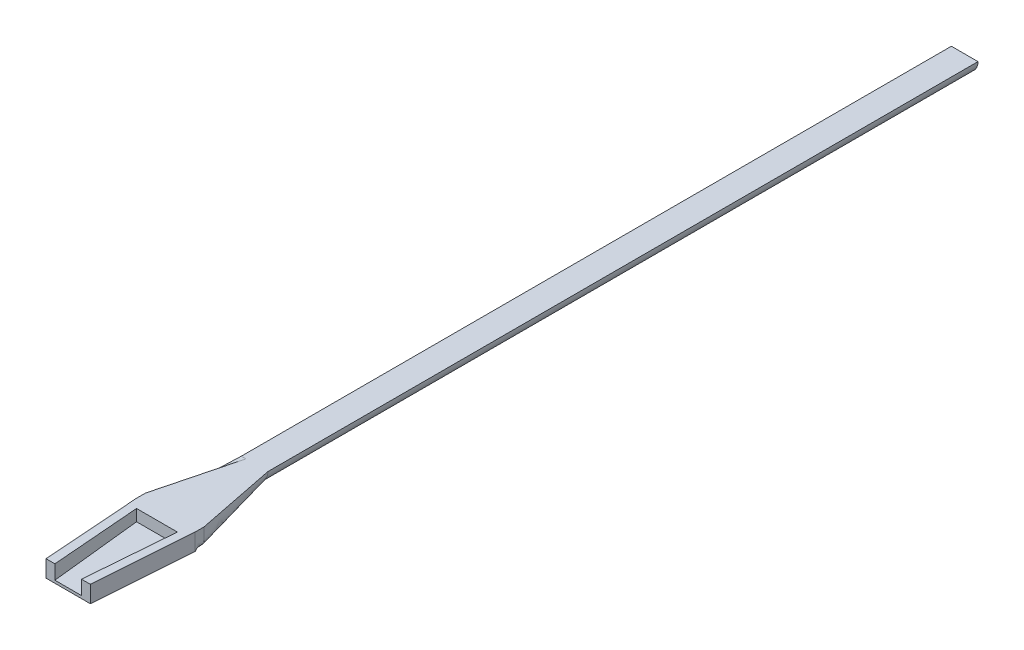
ISO-10303-21;
HEADER;
FILE_DESCRIPTION(('STEP AP214'),'2;1');
FILE_NAME('part.step','',(''),(''),'','','');
FILE_SCHEMA(('AUTOMOTIVE_DESIGN { 1 0 10303 214 1 1 1 1 }'));
ENDSEC;
DATA;
#1=APPLICATION_CONTEXT('core data for automotive mechanical design processes');
#2=APPLICATION_PROTOCOL_DEFINITION('international standard','automotive_design',2000,#1);
#3=PRODUCT_CONTEXT('',#1,'mechanical');
#4=PRODUCT('Part','Part','',(#3));
#5=PRODUCT_RELATED_PRODUCT_CATEGORY('part','',(#4));
#6=PRODUCT_DEFINITION_FORMATION('','',#4);
#7=PRODUCT_DEFINITION_CONTEXT('part definition',#1,'design');
#8=PRODUCT_DEFINITION('design','',#6,#7);
#9=PRODUCT_DEFINITION_SHAPE('','',#8);
#10=(LENGTH_UNIT() NAMED_UNIT(*) SI_UNIT(.MILLI.,.METRE.));
#11=(NAMED_UNIT(*) PLANE_ANGLE_UNIT() SI_UNIT($,.RADIAN.));
#12=(NAMED_UNIT(*) SI_UNIT($,.STERADIAN.) SOLID_ANGLE_UNIT());
#13=UNCERTAINTY_MEASURE_WITH_UNIT(LENGTH_MEASURE(1.E-05),#10,'distance_accuracy_value','');
#14=(GEOMETRIC_REPRESENTATION_CONTEXT(3) GLOBAL_UNCERTAINTY_ASSIGNED_CONTEXT((#13)) GLOBAL_UNIT_ASSIGNED_CONTEXT((#10,
#11,#12)) REPRESENTATION_CONTEXT('',''));
#15=CARTESIAN_POINT('',(0.,0.,0.));
#16=DIRECTION('',(0.,0.,1.));
#17=DIRECTION('',(1.,0.,0.));
#18=AXIS2_PLACEMENT_3D('',#15,#16,#17);
#19=CARTESIAN_POINT('',(0.,0.,-90.));
#20=DIRECTION('',(0.,0.,1.));
#21=DIRECTION('',(1.,0.,0.));
#22=AXIS2_PLACEMENT_3D('',#19,#20,#21);
#23=CYLINDRICAL_SURFACE('',#22,1.5);
#24=DIRECTION('',(0.,0.,1.));
#25=VECTOR('',#24,1.);
#26=CARTESIAN_POINT('',(1.5,0.,-90.));
#27=LINE('',#26,#25);
#28=CARTESIAN_POINT('',(1.5,0.,-10.));
#29=VERTEX_POINT('',#28);
#30=CARTESIAN_POINT('',(1.5,0.,-90.));
#31=VERTEX_POINT('',#30);
#32=EDGE_CURVE('E400',#29,#31,#27,.F.);
#33=ORIENTED_EDGE('',*,*,#32,.F.);
#34=CARTESIAN_POINT('',(-1.5,0.,-10.));
#35=CARTESIAN_POINT('',(-1.5,-0.0340849035523239,-10.));
#36=CARTESIAN_POINT('',(-1.49770013870791,-0.100364686866846,-10.));
#37=CARTESIAN_POINT('',(-1.48805703988034,-0.197016495207658,-9.99999999999999));
#38=CARTESIAN_POINT('',(-1.47217993167286,-0.293078553098663,-10.));
#39=CARTESIAN_POINT('',(-1.45702067216842,-0.358160066350974,-10.));
#40=CARTESIAN_POINT('',(-1.38020657400928,-0.642319357134759,-10.));
#41=CARTESIAN_POINT('',(-1.1105933390229,-1.11010631694387,-10.));
#42=CARTESIAN_POINT('',(-0.405829361337868,-1.51725944924718,-10.));
#43=CARTESIAN_POINT('',(0.40809019758457,-1.51631658641463,-10.));
#44=CARTESIAN_POINT('',(0.875236322684468,-1.24559452589605,-10.));
#45=CARTESIAN_POINT('',(1.08365515619601,-1.03772798685612,-10.));
#46=CARTESIAN_POINT('',(1.12928105154975,-0.988904998529896,-9.99999999999999));
#47=CARTESIAN_POINT('',(1.19099547505305,-0.913596755535237,-10.));
#48=CARTESIAN_POINT('',(1.24760275662092,-0.834665284726423,-9.99999999999999));
#49=CARTESIAN_POINT('',(1.28268462080514,-0.778384188046074,-10.));
#50=CARTESIAN_POINT('',(1.33177957928485,-0.693175264975758,-10.));
#51=CARTESIAN_POINT('',(1.38954267851461,-0.576307118216063,-9.99999999999999));
#52=CARTESIAN_POINT('',(1.45327996055997,-0.388723046354751,-10.));
#53=CARTESIAN_POINT('',(1.49170409745565,-0.194367312456596,-9.99999999999999));
#54=CARTESIAN_POINT('',(1.5,-0.0642557061617075,-10.));
#55=CARTESIAN_POINT('',(1.5,0.,-10.));
#56=B_SPLINE_CURVE_WITH_KNOTS('',3,(#34,#35,#36,#37,#38,#39,#40,#41,#42,#43,#44,#45,#46,#47,#48,
#49,#50,#51,#52,#53,#54,#55),.UNSPECIFIED.,.F.,.F.,(4,1,1,1,2,1,1,1,2,1,1,1,2,1,1,1,4),(0.,
0.0218802470232264,0.0437604940464527,0.0656407410696791,0.0875209880929054,0.252512592855743,
0.417504197618581,0.582495802381419,0.747487407144257,0.769367654167483,0.791247901190709,
0.813128148213936,0.835008395237162,0.876256296427872,0.917504197618581,0.95875209880929,1.),.UNSPECIFIED.);
#57=CARTESIAN_POINT('',(-1.5,0.,-10.));
#58=VERTEX_POINT('',#57);
#59=EDGE_CURVE('E289',#58,#29,#56,.T.);
#60=ORIENTED_EDGE('',*,*,#59,.F.);
#61=DIRECTION('',(0.,0.,1.));
#62=VECTOR('',#61,1.);
#63=CARTESIAN_POINT('',(-1.5,0.,-90.));
#64=LINE('',#63,#62);
#65=CARTESIAN_POINT('',(-1.5,0.,-90.));
#66=VERTEX_POINT('',#65);
#67=EDGE_CURVE('E162',#66,#58,#64,.T.);
#68=ORIENTED_EDGE('',*,*,#67,.F.);
#69=CARTESIAN_POINT('',(0.,0.,-90.));
#70=DIRECTION('',(0.,0.,1.));
#71=DIRECTION('',(1.,0.,0.));
#72=AXIS2_PLACEMENT_3D('',#69,#70,#71);
#73=CIRCLE('',#72,1.5);
#74=EDGE_CURVE('E152',#66,#31,#73,.T.);
#75=ORIENTED_EDGE('',*,*,#74,.T.);
#76=EDGE_LOOP('',(#33,#60,#68,#75));
#77=FACE_BOUND('',#76,.T.);
#78=ADVANCED_FACE('F143',(#77),#23,.T.);
#79=CARTESIAN_POINT('',(0.,0.,-90.));
#80=DIRECTION('',(0.,0.,1.));
#81=DIRECTION('',(1.,0.,0.));
#82=AXIS2_PLACEMENT_3D('',#79,#80,#81);
#83=PLANE('',#82);
#84=ORIENTED_EDGE('',*,*,#74,.F.);
#85=DIRECTION('',(1.,0.,0.));
#86=VECTOR('',#85,1.);
#87=CARTESIAN_POINT('',(-3.58187881499397,0.,-90.));
#88=LINE('',#87,#86);
#89=EDGE_CURVE('E379',#66,#31,#88,.T.);
#90=ORIENTED_EDGE('',*,*,#89,.T.);
#91=EDGE_LOOP('',(#84,#90));
#92=FACE_BOUND('',#91,.T.);
#93=ADVANCED_FACE('F632',(#92),#83,.F.);
#94=CARTESIAN_POINT('',(-3.58187881499397,0.,-90.));
#95=DIRECTION('',(0.,-1.,0.));
#96=DIRECTION('',(0.,0.,-1.));
#97=AXIS2_PLACEMENT_3D('',#94,#95,#96);
#98=PLANE('',#97);
#99=ORIENTED_EDGE('',*,*,#32,.T.);
#100=ORIENTED_EDGE('',*,*,#89,.F.);
#101=ORIENTED_EDGE('',*,*,#67,.T.);
#102=DIRECTION('',(1.,0.,0.));
#103=VECTOR('',#102,1.);
#104=CARTESIAN_POINT('',(-3.58187881499397,0.,-9.99999999999999));
#105=LINE('',#104,#103);
#106=CARTESIAN_POINT('',(-0.975000000000002,0.,-10.));
#107=VERTEX_POINT('',#106);
#108=EDGE_CURVE('E12',#58,#107,#105,.T.);
#109=ORIENTED_EDGE('',*,*,#108,.T.);
#110=CARTESIAN_POINT('',(-3.3,0.,-1.));
#111=CARTESIAN_POINT('',(-0.975000000000003,0.,-10.));
#112=B_SPLINE_CURVE_WITH_KNOTS('',1,(#110,#111),.UNSPECIFIED.,.F.,.F.,(2,2),(0.,1.),.UNSPECIFIED.);
#113=CARTESIAN_POINT('',(-3.3,0.,-1.));
#114=VERTEX_POINT('',#113);
#115=EDGE_CURVE('E366',#107,#114,#112,.F.);
#116=ORIENTED_EDGE('',*,*,#115,.T.);
#117=DIRECTION('',(0.,0.,-1.));
#118=VECTOR('',#117,1.);
#119=CARTESIAN_POINT('',(-3.3,0.,-0.5));
#120=LINE('',#119,#118);
#121=CARTESIAN_POINT('',(-3.3,0.,0.));
#122=VERTEX_POINT('',#121);
#123=EDGE_CURVE('E661',#122,#114,#120,.T.);
#124=ORIENTED_EDGE('',*,*,#123,.F.);
#125=DIRECTION('',(-0.0725356957788214,0.,-0.997365816958794));
#126=VECTOR('',#125,1.);
#127=CARTESIAN_POINT('',(-3.28263729036501,0.,0.238737257481092));
#128=LINE('',#127,#126);
#129=CARTESIAN_POINT('',(-2.5,0.,11.));
#130=VERTEX_POINT('',#129);
#131=EDGE_CURVE('E536',#130,#122,#128,.T.);
#132=ORIENTED_EDGE('',*,*,#131,.F.);
#133=DIRECTION('',(-1.,0.,0.));
#134=VECTOR('',#133,1.);
#135=CARTESIAN_POINT('',(0.,0.,11.));
#136=LINE('',#135,#134);
#137=CARTESIAN_POINT('',(-1.5,0.,11.));
#138=VERTEX_POINT('',#137);
#139=EDGE_CURVE('E456',#138,#130,#136,.T.);
#140=ORIENTED_EDGE('',*,*,#139,.F.);
#141=DIRECTION('',(-0.0797452222828899,0.,-0.996815278536125));
#142=VECTOR('',#141,1.);
#143=CARTESIAN_POINT('',(-2.39261093999815,0.,-0.157636749976912));
#144=LINE('',#143,#142);
#145=CARTESIAN_POINT('',(-2.3,0.,1.));
#146=VERTEX_POINT('',#145);
#147=EDGE_CURVE('E431',#138,#146,#144,.T.);
#148=ORIENTED_EDGE('',*,*,#147,.T.);
#149=DIRECTION('',(-1.,0.,0.));
#150=VECTOR('',#149,1.);
#151=CARTESIAN_POINT('',(-4.36182031470955,0.,1.));
#152=LINE('',#151,#150);
#153=CARTESIAN_POINT('',(2.3,0.,1.));
#154=VERTEX_POINT('',#153);
#155=EDGE_CURVE('E427',#154,#146,#152,.T.);
#156=ORIENTED_EDGE('',*,*,#155,.F.);
#157=DIRECTION('',(-0.07974522228289,0.,0.996815278536125));
#158=VECTOR('',#157,1.);
#159=CARTESIAN_POINT('',(2.33713468798277,0.,0.535816400215386));
#160=LINE('',#159,#158);
#161=CARTESIAN_POINT('',(1.5,0.,11.));
#162=VERTEX_POINT('',#161);
#163=EDGE_CURVE('E425',#154,#162,#160,.T.);
#164=ORIENTED_EDGE('',*,*,#163,.T.);
#165=CARTESIAN_POINT('',(2.5,0.,11.));
#166=VERTEX_POINT('',#165);
#167=EDGE_CURVE('E258',#166,#162,#136,.T.);
#168=ORIENTED_EDGE('',*,*,#167,.F.);
#169=DIRECTION('',(-0.0725356957788214,0.,0.997365816958794));
#170=VECTOR('',#169,1.);
#171=CARTESIAN_POINT('',(3.28263729036501,0.,0.238737257481092));
#172=LINE('',#171,#170);
#173=CARTESIAN_POINT('',(3.3,0.,0.));
#174=VERTEX_POINT('',#173);
#175=EDGE_CURVE('E254',#174,#166,#172,.T.);
#176=ORIENTED_EDGE('',*,*,#175,.F.);
#177=DIRECTION('',(0.,0.,1.));
#178=VECTOR('',#177,1.);
#179=CARTESIAN_POINT('',(3.3,0.,-0.5));
#180=LINE('',#179,#178);
#181=CARTESIAN_POINT('',(3.3,0.,-1.));
#182=VERTEX_POINT('',#181);
#183=EDGE_CURVE('E240',#182,#174,#180,.T.);
#184=ORIENTED_EDGE('',*,*,#183,.F.);
#185=CARTESIAN_POINT('',(1.5,0.,-10.));
#186=CARTESIAN_POINT('',(3.3,0.,-1.));
#187=B_SPLINE_CURVE_WITH_KNOTS('',1,(#185,#186),.UNSPECIFIED.,.F.,.F.,(2,2),(0.,1.),.UNSPECIFIED.);
#188=EDGE_CURVE('E375',#182,#29,#187,.F.);
#189=ORIENTED_EDGE('',*,*,#188,.T.);
#190=EDGE_LOOP('',(#99,#100,#101,#109,#116,#124,#132,#140,#148,#156,#164,#168,#176,#184,#189));
#191=FACE_BOUND('',#190,.T.);
#192=ADVANCED_FACE('F255',(#191),#98,.F.);
#193=CARTESIAN_POINT('',(-0.975000000000003,0.,-10.));
#194=CARTESIAN_POINT('',(-3.3,0.,-1.));
#195=CARTESIAN_POINT('',(-1.5,0.,-10.));
#196=CARTESIAN_POINT('',(-3.3,-1.4,-1.));
#197=B_SPLINE_SURFACE_WITH_KNOTS('',1,1,((#193,#194),(#195,#196)),.UNSPECIFIED.,.F.,.F.,.F.,(2,
2),(2,2),(0.,1.),(0.,1.),.UNSPECIFIED.);
#198=CARTESIAN_POINT('',(-1.5,0.,-10.));
#199=CARTESIAN_POINT('',(-3.3,-1.4,-1.));
#200=B_SPLINE_CURVE_WITH_KNOTS('',1,(#198,#199),.UNSPECIFIED.,.F.,.F.,(2,2),(0.,1.),.UNSPECIFIED.);
#201=CARTESIAN_POINT('',(-3.3,-1.4,-1.));
#202=VERTEX_POINT('',#201);
#203=EDGE_CURVE('E426',#58,#202,#200,.T.);
#204=CARTESIAN_POINT('',(-3.3,-1.4,-1.));
#205=CARTESIAN_POINT('',(-3.3,0.,-1.));
#206=B_SPLINE_CURVE_WITH_KNOTS('',1,(#204,#205),.UNSPECIFIED.,.F.,.F.,(2,2),(0.,1.),.UNSPECIFIED.);
#207=EDGE_CURVE('E356',#114,#202,#206,.F.);
#208=ORIENTED_EDGE('',*,*,#108,.F.);
#209=ORIENTED_EDGE('',*,*,#203,.T.);
#210=ORIENTED_EDGE('',*,*,#207,.F.);
#211=ORIENTED_EDGE('',*,*,#115,.F.);
#212=EDGE_LOOP('',(#208,#209,#210,#211));
#213=FACE_BOUND('',#212,.T.);
#214=ADVANCED_FACE('F308',(#213),#197,.T.);
#215=CARTESIAN_POINT('',(-1.5,0.,-10.));
#216=CARTESIAN_POINT('',(-3.3,-1.4,-1.));
#217=CARTESIAN_POINT('',(-1.5,-0.0340849035523239,-10.));
#218=CARTESIAN_POINT('',(-3.3,-1.46312167221356,-1.));
#219=CARTESIAN_POINT('',(-1.49770013870791,-0.100364686866846,-10.));
#220=CARTESIAN_POINT('',(-3.27564705688287,-1.5932935025808,-1.));
#221=CARTESIAN_POINT('',(-1.48805703988034,-0.197016495207658,-9.99999999999999));
#222=CARTESIAN_POINT('',(-3.16218878960373,-1.76446622574241,-1.));
#223=CARTESIAN_POINT('',(-1.47217993167286,-0.293078553098663,-10.));
#224=CARTESIAN_POINT('',(-2.9911345861593,-1.87627535213516,-1.));
#225=CARTESIAN_POINT('',(-1.45702067216842,-0.358160066350974,-10.));
#226=CARTESIAN_POINT('',(-2.86230387603072,-1.9,-1.));
#227=CARTESIAN_POINT('',(-1.38020657400928,-0.642319357134759,-10.));
#228=CARTESIAN_POINT('',(-2.33018736281965,-1.9,-1.));
#229=CARTESIAN_POINT('',(-1.1105933390229,-1.11010631694387,-10.));
#230=CARTESIAN_POINT('',(-1.39532779393049,-1.9,-1.));
#231=CARTESIAN_POINT('',(-0.405829361337868,-1.51725944924718,-10.));
#232=CARTESIAN_POINT('',(0.,-1.9,-0.999999999999998));
#233=CARTESIAN_POINT('',(0.40809019758457,-1.51631658641463,-10.));
#234=CARTESIAN_POINT('',(1.39532779393049,-1.9,-1.));
#235=CARTESIAN_POINT('',(0.875236322684468,-1.24559452589605,-10.));
#236=CARTESIAN_POINT('',(2.33018736281965,-1.9,-1.));
#237=CARTESIAN_POINT('',(1.08365515619601,-1.03772798685612,-10.));
#238=CARTESIAN_POINT('',(2.86230387603072,-1.9,-1.));
#239=CARTESIAN_POINT('',(1.12928105154975,-0.988904998529896,-9.99999999999999));
#240=CARTESIAN_POINT('',(2.99113458615929,-1.87627535213516,-1.));
#241=CARTESIAN_POINT('',(1.19099547505305,-0.913596755535237,-10.));
#242=CARTESIAN_POINT('',(3.16218878960373,-1.76446622574241,-1.));
#243=CARTESIAN_POINT('',(1.24760275662092,-0.834665284726423,-9.99999999999999));
#244=CARTESIAN_POINT('',(3.27564705688286,-1.5932935025808,-0.999999999999999));
#245=CARTESIAN_POINT('',(1.28268462080514,-0.778384188046074,-10.));
#246=CARTESIAN_POINT('',(3.3,-1.46312167221357,-1.));
#247=CARTESIAN_POINT('',(1.33177957928485,-0.693175264975758,-10.));
#248=CARTESIAN_POINT('',(3.3,-1.28100515900782,-1.));
#249=CARTESIAN_POINT('',(1.38954267851461,-0.576307118216063,-9.99999999999999));
#250=CARTESIAN_POINT('',(3.3,-1.04660877261765,-0.999999999999999));
#251=CARTESIAN_POINT('',(1.45327996055997,-0.388723046354751,-10.));
#252=CARTESIAN_POINT('',(3.3,-0.7,-1.));
#253=CARTESIAN_POINT('',(1.49170409745565,-0.194367312456596,-9.99999999999999));
#254=CARTESIAN_POINT('',(3.3,-0.353391227382354,-0.999999999999999));
#255=CARTESIAN_POINT('',(1.5,-0.0642557061617075,-10.));
#256=CARTESIAN_POINT('',(3.3,-0.118994840992179,-1.));
#257=CARTESIAN_POINT('',(1.5,0.,-10.));
#258=CARTESIAN_POINT('',(3.3,0.,-1.));
#259=B_SPLINE_SURFACE_WITH_KNOTS('',3,1,((#215,#216),(#217,#218),(#219,#220),(#221,#222),(#223,
#224),(#225,#226),(#227,#228),(#229,#230),(#231,#232),(#233,#234),(#235,#236),(#237,#238),(#239,
#240),(#241,#242),(#243,#244),(#245,#246),(#247,#248),(#249,#250),(#251,#252),(#253,#254),(#255,
#256),(#257,#258)),.UNSPECIFIED.,.F.,.F.,.F.,(4,1,1,1,2,1,1,1,2,1,1,1,2,1,1,1,4),(2,2),(0.,
0.0218802470232264,0.0437604940464527,0.0656407410696791,0.0875209880929054,0.252512592855743,
0.417504197618581,0.582495802381419,0.747487407144257,0.769367654167483,0.791247901190709,
0.813128148213936,0.835008395237162,0.876256296427872,0.917504197618581,0.95875209880929,1.),
(0.,1.),.UNSPECIFIED.);
#260=CARTESIAN_POINT('',(2.8,-1.9,-1.));
#261=CARTESIAN_POINT('',(2.8634613838908,-1.9,-1.));
#262=CARTESIAN_POINT('',(2.99341230687717,-1.87539276065853,-1.));
#263=CARTESIAN_POINT('',(3.16312222033253,-1.76320521238392,-1.));
#264=CARTESIAN_POINT('',(3.27542213843699,-1.59338446295593,-0.999999999999999));
#265=CARTESIAN_POINT('',(3.3,-1.4634613838908,-1.));
#266=CARTESIAN_POINT('',(3.3,-1.28134487068727,-1.));
#267=CARTESIAN_POINT('',(3.3,-1.04709122626305,-1.));
#268=CARTESIAN_POINT('',(3.3,-0.7,-1.));
#269=CARTESIAN_POINT('',(3.3,-0.35290877373695,-0.999999999999999));
#270=CARTESIAN_POINT('',(3.3,-0.118655129312731,-1.));
#271=CARTESIAN_POINT('',(3.3,0.,-1.));
#272=B_SPLINE_CURVE_WITH_KNOTS('',3,(#260,#261,#262,#263,#264,#265,#266,#267,#268,#269,#270,
#271),.UNSPECIFIED.,.F.,.F.,(4,1,1,1,2,1,1,1,4),(0.,0.0871164605607591,0.174232921121518,
0.261349381682277,0.348465842243036,0.511349381682277,0.674232921121518,0.837116460560759,1.),.UNSPECIFIED.);
#273=CARTESIAN_POINT('',(3.3,-1.40000000000001,-1.));
#274=VERTEX_POINT('',#273);
#275=EDGE_CURVE('E248',#274,#182,#272,.T.);
#276=CARTESIAN_POINT('',(2.8,-1.9,-1.));
#277=CARTESIAN_POINT('',(2.8634613838908,-1.9,-1.));
#278=CARTESIAN_POINT('',(2.99341230687717,-1.87539276065853,-1.));
#279=CARTESIAN_POINT('',(3.16312222033253,-1.76320521238392,-1.));
#280=CARTESIAN_POINT('',(3.27542213843699,-1.59338446295593,-0.999999999999999));
#281=CARTESIAN_POINT('',(3.3,-1.4634613838908,-1.));
#282=CARTESIAN_POINT('',(3.3,-1.28134487068727,-1.));
#283=CARTESIAN_POINT('',(3.3,-1.04709122626305,-1.));
#284=CARTESIAN_POINT('',(3.3,-0.7,-1.));
#285=CARTESIAN_POINT('',(3.3,-0.35290877373695,-0.999999999999999));
#286=CARTESIAN_POINT('',(3.3,-0.118655129312731,-1.));
#287=CARTESIAN_POINT('',(3.3,0.,-1.));
#288=B_SPLINE_CURVE_WITH_KNOTS('',3,(#276,#277,#278,#279,#280,#281,#282,#283,#284,#285,#286,
#287),.UNSPECIFIED.,.F.,.F.,(4,1,1,1,2,1,1,1,4),(0.,0.0871164605607591,0.174232921121518,
0.261349381682277,0.348465842243036,0.511349381682277,0.674232921121518,0.837116460560759,1.),.UNSPECIFIED.);
#289=CARTESIAN_POINT('',(2.8,-1.9,-1.));
#290=VERTEX_POINT('',#289);
#291=EDGE_CURVE('E648',#290,#274,#288,.T.);
#292=CARTESIAN_POINT('',(-3.3,-1.4,-1.));
#293=CARTESIAN_POINT('',(-3.3,-1.46254259421884,-1.));
#294=CARTESIAN_POINT('',(-3.2760739513545,-1.59195495654766,-0.999999999999999));
#295=CARTESIAN_POINT('',(-3.16341441415953,-1.76332487724037,-1.));
#296=CARTESIAN_POINT('',(-2.99192001684146,-1.87610432454889,-0.999999999999999));
#297=CARTESIAN_POINT('',(-2.86254259421884,-1.9,-1.));
#298=CARTESIAN_POINT('',(-2.33042608100932,-1.9,-1.));
#299=CARTESIAN_POINT('',(-1.39567906672759,-1.9,-0.999999999999999));
#300=CARTESIAN_POINT('',(0.,-1.9,-1.));
#301=CARTESIAN_POINT('',(1.39567906672759,-1.9,-0.999999999999999));
#302=CARTESIAN_POINT('',(2.33042608100932,-1.9,-1.));
#303=CARTESIAN_POINT('',(2.8,-1.9,-1.));
#304=B_SPLINE_CURVE_WITH_KNOTS('',3,(#292,#293,#294,#295,#296,#297,#298,#299,#300,#301,#302,
#303),.UNSPECIFIED.,.F.,.F.,(4,1,1,1,2,1,1,1,4),(0.,0.0293838816431009,0.0587677632862018,
0.0881516449293027,0.117535526572404,0.338151644929303,0.558767763286202,0.779383881643101,1.),.UNSPECIFIED.);
#305=CARTESIAN_POINT('',(-2.8,-1.9,-1.));
#306=VERTEX_POINT('',#305);
#307=EDGE_CURVE('E649',#306,#290,#304,.T.);
#308=CARTESIAN_POINT('',(-3.3,-1.4,-1.));
#309=CARTESIAN_POINT('',(-3.3,-1.46254259421884,-1.));
#310=CARTESIAN_POINT('',(-3.2760739513545,-1.59195495654766,-0.999999999999999));
#311=CARTESIAN_POINT('',(-3.16341441415953,-1.76332487724037,-1.));
#312=CARTESIAN_POINT('',(-2.99192001684146,-1.87610432454889,-0.999999999999999));
#313=CARTESIAN_POINT('',(-2.86254259421884,-1.9,-1.));
#314=CARTESIAN_POINT('',(-2.33042608100932,-1.9,-1.));
#315=CARTESIAN_POINT('',(-1.39567906672759,-1.9,-0.999999999999999));
#316=CARTESIAN_POINT('',(0.,-1.9,-1.));
#317=CARTESIAN_POINT('',(1.39567906672759,-1.9,-0.999999999999999));
#318=CARTESIAN_POINT('',(2.33042608100932,-1.9,-1.));
#319=CARTESIAN_POINT('',(2.8,-1.9,-1.));
#320=B_SPLINE_CURVE_WITH_KNOTS('',3,(#308,#309,#310,#311,#312,#313,#314,#315,#316,#317,#318,
#319),.UNSPECIFIED.,.F.,.F.,(4,1,1,1,2,1,1,1,4),(0.,0.0293838816431009,0.0587677632862018,
0.0881516449293027,0.117535526572404,0.338151644929303,0.558767763286202,0.779383881643101,1.),.UNSPECIFIED.);
#321=EDGE_CURVE('E647',#202,#306,#320,.T.);
#322=ORIENTED_EDGE('',*,*,#59,.T.);
#323=ORIENTED_EDGE('',*,*,#188,.F.);
#324=ORIENTED_EDGE('',*,*,#275,.F.);
#325=ORIENTED_EDGE('',*,*,#291,.F.);
#326=ORIENTED_EDGE('',*,*,#307,.F.);
#327=ORIENTED_EDGE('',*,*,#321,.F.);
#328=ORIENTED_EDGE('',*,*,#203,.F.);
#329=EDGE_LOOP('',(#322,#323,#324,#325,#326,#327,#328));
#330=FACE_BOUND('',#329,.T.);
#331=ADVANCED_FACE('F295',(#330),#259,.T.);
#332=CARTESIAN_POINT('',(0.,0.,11.));
#333=DIRECTION('',(0.,0.,-1.));
#334=DIRECTION('',(-1.,0.,0.));
#335=AXIS2_PLACEMENT_3D('',#332,#333,#334);
#336=PLANE('',#335);
#337=ORIENTED_EDGE('',*,*,#167,.T.);
#338=DIRECTION('',(0.,1.,0.));
#339=VECTOR('',#338,1.);
#340=CARTESIAN_POINT('',(1.5,-1.6,11.));
#341=LINE('',#340,#339);
#342=CARTESIAN_POINT('',(1.5,-1.6,11.));
#343=VERTEX_POINT('',#342);
#344=EDGE_CURVE('E666',#343,#162,#341,.T.);
#345=ORIENTED_EDGE('',*,*,#344,.F.);
#346=DIRECTION('',(1.,0.,0.));
#347=VECTOR('',#346,1.);
#348=CARTESIAN_POINT('',(-1.5,-1.6,11.));
#349=LINE('',#348,#347);
#350=CARTESIAN_POINT('',(-1.5,-1.6,11.));
#351=VERTEX_POINT('',#350);
#352=EDGE_CURVE('E742',#351,#343,#349,.T.);
#353=ORIENTED_EDGE('',*,*,#352,.F.);
#354=DIRECTION('',(0.,-1.,0.));
#355=VECTOR('',#354,1.);
#356=CARTESIAN_POINT('',(-1.5,-1.6,11.));
#357=LINE('',#356,#355);
#358=EDGE_CURVE('E744',#138,#351,#357,.T.);
#359=ORIENTED_EDGE('',*,*,#358,.F.);
#360=ORIENTED_EDGE('',*,*,#139,.T.);
#361=DIRECTION('',(0.,-1.,0.));
#362=VECTOR('',#361,1.);
#363=CARTESIAN_POINT('',(-2.5,-1.9,11.));
#364=LINE('',#363,#362);
#365=CARTESIAN_POINT('',(-2.5,-1.9,11.));
#366=VERTEX_POINT('',#365);
#367=EDGE_CURVE('E545',#130,#366,#364,.T.);
#368=ORIENTED_EDGE('',*,*,#367,.T.);
#369=DIRECTION('',(1.,0.,0.));
#370=VECTOR('',#369,1.);
#371=CARTESIAN_POINT('',(-2.5,-1.9,11.));
#372=LINE('',#371,#370);
#373=CARTESIAN_POINT('',(2.5,-1.9,11.));
#374=VERTEX_POINT('',#373);
#375=EDGE_CURVE('E540',#366,#374,#372,.T.);
#376=ORIENTED_EDGE('',*,*,#375,.T.);
#377=DIRECTION('',(0.,1.,0.));
#378=VECTOR('',#377,1.);
#379=CARTESIAN_POINT('',(2.5,-1.9,11.));
#380=LINE('',#379,#378);
#381=EDGE_CURVE('E531',#374,#166,#380,.T.);
#382=ORIENTED_EDGE('',*,*,#381,.T.);
#383=EDGE_LOOP('',(#337,#345,#353,#359,#360,#368,#376,#382));
#384=FACE_BOUND('',#383,.T.);
#385=ADVANCED_FACE('F307',(#384),#336,.F.);
#386=CARTESIAN_POINT('',(3.28263729036501,0.,0.238737257481092));
#387=DIRECTION('',(-0.997365816958794,0.,-0.0725356957788214));
#388=DIRECTION('',(-0.0725356957788214,0.,0.997365816958794));
#389=AXIS2_PLACEMENT_3D('',#386,#387,#388);
#390=PLANE('',#389);
#391=DIRECTION('',(0.,1.,0.));
#392=VECTOR('',#391,1.);
#393=CARTESIAN_POINT('',(3.3,-1.9,0.));
#394=LINE('',#393,#392);
#395=CARTESIAN_POINT('',(3.3,-1.9,0.));
#396=VERTEX_POINT('',#395);
#397=EDGE_CURVE('E245',#396,#174,#394,.T.);
#398=ORIENTED_EDGE('',*,*,#397,.T.);
#399=ORIENTED_EDGE('',*,*,#175,.T.);
#400=ORIENTED_EDGE('',*,*,#381,.F.);
#401=DIRECTION('',(-0.0725356957788214,0.,0.997365816958794));
#402=VECTOR('',#401,1.);
#403=CARTESIAN_POINT('',(3.3,-1.9,0.));
#404=LINE('',#403,#402);
#405=EDGE_CURVE('E266',#396,#374,#404,.T.);
#406=ORIENTED_EDGE('',*,*,#405,.F.);
#407=EDGE_LOOP('',(#398,#399,#400,#406));
#408=FACE_BOUND('',#407,.T.);
#409=ADVANCED_FACE('F264',(#408),#390,.F.);
#410=CARTESIAN_POINT('',(-3.28263729036501,0.,0.238737257481092));
#411=DIRECTION('',(0.997365816958794,0.,-0.0725356957788214));
#412=DIRECTION('',(-0.0725356957788214,0.,-0.997365816958794));
#413=AXIS2_PLACEMENT_3D('',#410,#411,#412);
#414=PLANE('',#413);
#415=ORIENTED_EDGE('',*,*,#367,.F.);
#416=ORIENTED_EDGE('',*,*,#131,.T.);
#417=DIRECTION('',(0.,-1.,0.));
#418=VECTOR('',#417,1.);
#419=CARTESIAN_POINT('',(-3.3,-1.9,0.));
#420=LINE('',#419,#418);
#421=CARTESIAN_POINT('',(-3.3,-1.9,0.));
#422=VERTEX_POINT('',#421);
#423=EDGE_CURVE('E268',#122,#422,#420,.T.);
#424=ORIENTED_EDGE('',*,*,#423,.T.);
#425=DIRECTION('',(0.0725356957788214,0.,0.997365816958794));
#426=VECTOR('',#425,1.);
#427=CARTESIAN_POINT('',(-3.3,-1.9,0.));
#428=LINE('',#427,#426);
#429=EDGE_CURVE('E282',#422,#366,#428,.T.);
#430=ORIENTED_EDGE('',*,*,#429,.T.);
#431=EDGE_LOOP('',(#415,#416,#424,#430));
#432=FACE_BOUND('',#431,.T.);
#433=ADVANCED_FACE('F594',(#432),#414,.F.);
#434=CARTESIAN_POINT('',(0.,-1.9,0.));
#435=DIRECTION('',(0.,1.,0.));
#436=DIRECTION('',(0.,0.,1.));
#437=AXIS2_PLACEMENT_3D('',#434,#435,#436);
#438=PLANE('',#437);
#439=ORIENTED_EDGE('',*,*,#405,.T.);
#440=ORIENTED_EDGE('',*,*,#375,.F.);
#441=ORIENTED_EDGE('',*,*,#429,.F.);
#442=DIRECTION('',(1.,0.,0.));
#443=VECTOR('',#442,1.);
#444=CARTESIAN_POINT('',(-3.3,-1.9,0.));
#445=LINE('',#444,#443);
#446=EDGE_CURVE('E271',#422,#396,#445,.T.);
#447=ORIENTED_EDGE('',*,*,#446,.T.);
#448=EDGE_LOOP('',(#439,#440,#441,#447));
#449=FACE_BOUND('',#448,.T.);
#450=ADVANCED_FACE('F503',(#449),#438,.F.);
#451=CARTESIAN_POINT('',(0.,0.,1.));
#452=DIRECTION('',(0.,0.,1.));
#453=DIRECTION('',(1.,0.,0.));
#454=AXIS2_PLACEMENT_3D('',#451,#452,#453);
#455=PLANE('',#454);
#456=ORIENTED_EDGE('',*,*,#155,.T.);
#457=DIRECTION('',(0.,-1.,0.));
#458=VECTOR('',#457,1.);
#459=CARTESIAN_POINT('',(-2.3,-1.3,1.));
#460=LINE('',#459,#458);
#461=CARTESIAN_POINT('',(-2.3,-1.3,1.));
#462=VERTEX_POINT('',#461);
#463=EDGE_CURVE('E438',#146,#462,#460,.T.);
#464=ORIENTED_EDGE('',*,*,#463,.T.);
#465=DIRECTION('',(1.,0.,0.));
#466=VECTOR('',#465,1.);
#467=CARTESIAN_POINT('',(2.3,-1.3,1.));
#468=LINE('',#467,#466);
#469=CARTESIAN_POINT('',(2.3,-1.3,1.));
#470=VERTEX_POINT('',#469);
#471=EDGE_CURVE('E452',#462,#470,#468,.T.);
#472=ORIENTED_EDGE('',*,*,#471,.T.);
#473=DIRECTION('',(0.,1.,0.));
#474=VECTOR('',#473,1.);
#475=CARTESIAN_POINT('',(2.3,-1.3,1.));
#476=LINE('',#475,#474);
#477=EDGE_CURVE('E441',#470,#154,#476,.T.);
#478=ORIENTED_EDGE('',*,*,#477,.T.);
#479=EDGE_LOOP('',(#456,#464,#472,#478));
#480=FACE_BOUND('',#479,.T.);
#481=ADVANCED_FACE('F469',(#480),#455,.T.);
#482=CARTESIAN_POINT('',(2.36486486486486,0.,0.189189189189189));
#483=DIRECTION('',(0.996815278536125,0.,0.07974522228289));
#484=DIRECTION('',(0.07974522228289,0.,-0.996815278536125));
#485=AXIS2_PLACEMENT_3D('',#482,#483,#484);
#486=PLANE('',#485);
#487=ORIENTED_EDGE('',*,*,#477,.F.);
#488=DIRECTION('',(0.0797095890362908,0.029891095888609,-0.996369862953634));
#489=VECTOR('',#488,1.);
#490=CARTESIAN_POINT('',(1.5,-1.6,11.));
#491=LINE('',#490,#489);
#492=EDGE_CURVE('E478',#343,#470,#491,.T.);
#493=ORIENTED_EDGE('',*,*,#492,.F.);
#494=ORIENTED_EDGE('',*,*,#344,.T.);
#495=ORIENTED_EDGE('',*,*,#163,.F.);
#496=EDGE_LOOP('',(#487,#493,#494,#495));
#497=FACE_BOUND('',#496,.T.);
#498=ADVANCED_FACE('F477',(#497),#486,.F.);
#499=CARTESIAN_POINT('',(-2.36486486486486,0.,0.189189189189189));
#500=DIRECTION('',(-0.996815278536125,0.,0.0797452222828899));
#501=DIRECTION('',(0.0797452222828899,0.,0.996815278536125));
#502=AXIS2_PLACEMENT_3D('',#499,#500,#501);
#503=PLANE('',#502);
#504=ORIENTED_EDGE('',*,*,#358,.T.);
#505=DIRECTION('',(-0.0797095890362907,0.029891095888609,-0.996369862953634));
#506=VECTOR('',#505,1.);
#507=CARTESIAN_POINT('',(-1.5,-1.6,11.));
#508=LINE('',#507,#506);
#509=EDGE_CURVE('E442',#351,#462,#508,.T.);
#510=ORIENTED_EDGE('',*,*,#509,.T.);
#511=ORIENTED_EDGE('',*,*,#463,.F.);
#512=ORIENTED_EDGE('',*,*,#147,.F.);
#513=EDGE_LOOP('',(#504,#510,#511,#512));
#514=FACE_BOUND('',#513,.T.);
#515=ADVANCED_FACE('F489',(#514),#503,.F.);
#516=CARTESIAN_POINT('',(0.,-1.268858027775,-0.03806574083325));
#517=DIRECTION('',(0.,-0.999550303522367,-0.0299865091056709));
#518=DIRECTION('',(0.,0.0299865091056709,-0.999550303522367));
#519=AXIS2_PLACEMENT_3D('',#516,#517,#518);
#520=PLANE('',#519);
#521=ORIENTED_EDGE('',*,*,#509,.F.);
#522=ORIENTED_EDGE('',*,*,#352,.T.);
#523=ORIENTED_EDGE('',*,*,#492,.T.);
#524=ORIENTED_EDGE('',*,*,#471,.F.);
#525=EDGE_LOOP('',(#521,#522,#523,#524));
#526=FACE_BOUND('',#525,.T.);
#527=ADVANCED_FACE('F497',(#526),#520,.F.);
#528=CARTESIAN_POINT('',(3.3,0.,0.));
#529=CARTESIAN_POINT('',(3.3,0.,-1.));
#530=CARTESIAN_POINT('',(3.3,-0.103159574978186,0.));
#531=CARTESIAN_POINT('',(3.3,-0.118655129312731,-1.));
#532=CARTESIAN_POINT('',(3.3,-0.312449053668613,0.));
#533=CARTESIAN_POINT('',(3.3,-0.35290877373695,-0.999999999999999));
#534=CARTESIAN_POINT('',(3.3,-0.631197247275268,0.));
#535=CARTESIAN_POINT('',(3.3,-0.7,-1.));
#536=CARTESIAN_POINT('',(3.3,-0.949945440881921,0.));
#537=CARTESIAN_POINT('',(3.3,-1.04709122626305,-1.));
#538=CARTESIAN_POINT('',(3.3,-1.15923491957235,0.));
#539=CARTESIAN_POINT('',(3.3,-1.28134487068727,-1.));
#540=CARTESIAN_POINT('',(3.3,-1.31756825290568,0.));
#541=CARTESIAN_POINT('',(3.3,-1.4634613838908,-1.));
#542=CARTESIAN_POINT('',(3.3,-1.42468864529987,0.));
#543=CARTESIAN_POINT('',(3.27542213843699,-1.59338446295593,-0.999999999999999));
#544=CARTESIAN_POINT('',(3.3,-1.58119724727527,0.));
#545=CARTESIAN_POINT('',(3.16312222033253,-1.76320521238392,-1.));
#546=CARTESIAN_POINT('',(3.30000000000001,-1.73770584925067,0.));
#547=CARTESIAN_POINT('',(2.99341230687717,-1.87539276065853,-1.));
#548=CARTESIAN_POINT('',(3.3,-1.84482624164485,0.));
#549=CARTESIAN_POINT('',(2.8634613838908,-1.9,-1.));
#550=CARTESIAN_POINT('',(3.3,-1.9,0.));
#551=CARTESIAN_POINT('',(2.8,-1.9,-1.));
#552=B_SPLINE_SURFACE_WITH_KNOTS('',3,1,((#528,#529),(#530,#531),(#532,#533),(#534,#535),(#536,
#537),(#538,#539),(#540,#541),(#542,#543),(#544,#545),(#546,#547),(#548,#549),(#550,#551)),
.UNSPECIFIED.,.F.,.F.,.F.,(4,1,1,1,2,1,1,1,4),(2,2),(0.,0.162883539439241,0.325767078878482,
0.488650618317723,0.651534157756964,0.738650618317723,0.825767078878482,0.912883539439241,1.),
(0.,1.),.UNSPECIFIED.);
#553=DIRECTION('',(-0.44721359549996,0.,-0.894427190999915));
#554=VECTOR('',#553,1.);
#555=CARTESIAN_POINT('',(3.05,-1.9,-0.5));
#556=LINE('',#555,#554);
#557=EDGE_CURVE('E251',#396,#290,#556,.T.);
#558=ORIENTED_EDGE('',*,*,#397,.F.);
#559=ORIENTED_EDGE('',*,*,#557,.T.);
#560=ORIENTED_EDGE('',*,*,#291,.T.);
#561=ORIENTED_EDGE('',*,*,#275,.T.);
#562=ORIENTED_EDGE('',*,*,#183,.T.);
#563=EDGE_LOOP('',(#558,#559,#560,#561,#562));
#564=FACE_BOUND('',#563,.T.);
#565=ADVANCED_FACE('F242',(#564),#552,.T.);
#566=CARTESIAN_POINT('',(3.3,-1.9,0.));
#567=CARTESIAN_POINT('',(2.8,-1.9,-1.));
#568=CARTESIAN_POINT('',(2.81464453961482,-1.9,0.));
#569=CARTESIAN_POINT('',(2.33042608100932,-1.9,-1.));
#570=CARTESIAN_POINT('',(1.83950048335386,-1.9,0.));
#571=CARTESIAN_POINT('',(1.39567906672759,-1.9,-0.999999999999999));
#572=CARTESIAN_POINT('',(0.369971915629535,-1.9,0.));
#573=CARTESIAN_POINT('',(0.,-1.9,-1.));
#574=CARTESIAN_POINT('',(-1.09955665209478,-1.9,0.));
#575=CARTESIAN_POINT('',(-1.39567906672759,-1.9,-0.999999999999999));
#576=CARTESIAN_POINT('',(-2.07470070835575,-1.9,0.));
#577=CARTESIAN_POINT('',(-2.33042608100932,-1.9,-1.));
#578=CARTESIAN_POINT('',(-2.62470070835575,-1.9,0.));
#579=CARTESIAN_POINT('',(-2.86254259421884,-1.9,-1.));
#580=CARTESIAN_POINT('',(-2.74921106802951,-1.9,0.));
#581=CARTESIAN_POINT('',(-2.99192001684146,-1.87610432454889,-0.999999999999999));
#582=CARTESIAN_POINT('',(-2.93002808437046,-1.9,0.));
#583=CARTESIAN_POINT('',(-3.16341441415953,-1.76332487724037,-1.));
#584=CARTESIAN_POINT('',(-3.11084510071142,-1.9,0.));
#585=CARTESIAN_POINT('',(-3.2760739513545,-1.59195495654766,-0.999999999999999));
#586=CARTESIAN_POINT('',(-3.23535546038518,-1.9,0.));
#587=CARTESIAN_POINT('',(-3.3,-1.46254259421884,-1.));
#588=CARTESIAN_POINT('',(-3.3,-1.9,0.));
#589=CARTESIAN_POINT('',(-3.3,-1.4,-1.));
#590=B_SPLINE_SURFACE_WITH_KNOTS('',3,1,((#566,#567),(#568,#569),(#570,#571),(#572,#573),(#574,
#575),(#576,#577),(#578,#579),(#580,#581),(#582,#583),(#584,#585),(#586,#587),(#588,#589)),
.UNSPECIFIED.,.F.,.F.,.F.,(4,1,1,1,2,1,1,1,4),(2,2),(0.,0.220616118356899,0.441232236713798,
0.661848355070697,0.882464473427596,0.911848355070697,0.941232236713798,0.970616118356899,1.),
(0.,1.),.UNSPECIFIED.);
#591=DIRECTION('',(0.,0.44721359549996,-0.894427190999915));
#592=VECTOR('',#591,1.);
#593=CARTESIAN_POINT('',(-3.3,-1.65,-0.5));
#594=LINE('',#593,#592);
#595=EDGE_CURVE('E659',#422,#202,#594,.T.);
#596=ORIENTED_EDGE('',*,*,#446,.F.);
#597=ORIENTED_EDGE('',*,*,#595,.T.);
#598=ORIENTED_EDGE('',*,*,#321,.T.);
#599=ORIENTED_EDGE('',*,*,#307,.T.);
#600=ORIENTED_EDGE('',*,*,#557,.F.);
#601=EDGE_LOOP('',(#596,#597,#598,#599,#600));
#602=FACE_BOUND('',#601,.T.);
#603=ADVANCED_FACE('F664',(#602),#590,.T.);
#604=CARTESIAN_POINT('',(-3.3,-1.9,0.));
#605=DIRECTION('',(-1.,0.,0.));
#606=DIRECTION('',(0.,1.,0.));
#607=AXIS2_PLACEMENT_3D('',#604,#605,#606);
#608=PLANE('',#607);
#609=ORIENTED_EDGE('',*,*,#423,.F.);
#610=ORIENTED_EDGE('',*,*,#123,.T.);
#611=ORIENTED_EDGE('',*,*,#207,.T.);
#612=ORIENTED_EDGE('',*,*,#595,.F.);
#613=EDGE_LOOP('',(#609,#610,#611,#612));
#614=FACE_BOUND('',#613,.T.);
#615=ADVANCED_FACE('F658',(#614),#608,.T.);
#616=CLOSED_SHELL('',(#78,#93,#192,#214,#331,#385,#409,#433,#450,#481,#498,#515,#527,#565,#603,#615));
#617=MANIFOLD_SOLID_BREP('B2',#616);
#618=ADVANCED_BREP_SHAPE_REPRESENTATION('',(#18,#617),#14);
#619=SHAPE_DEFINITION_REPRESENTATION(#9,#618);
ENDSEC;
END-ISO-10303-21;
